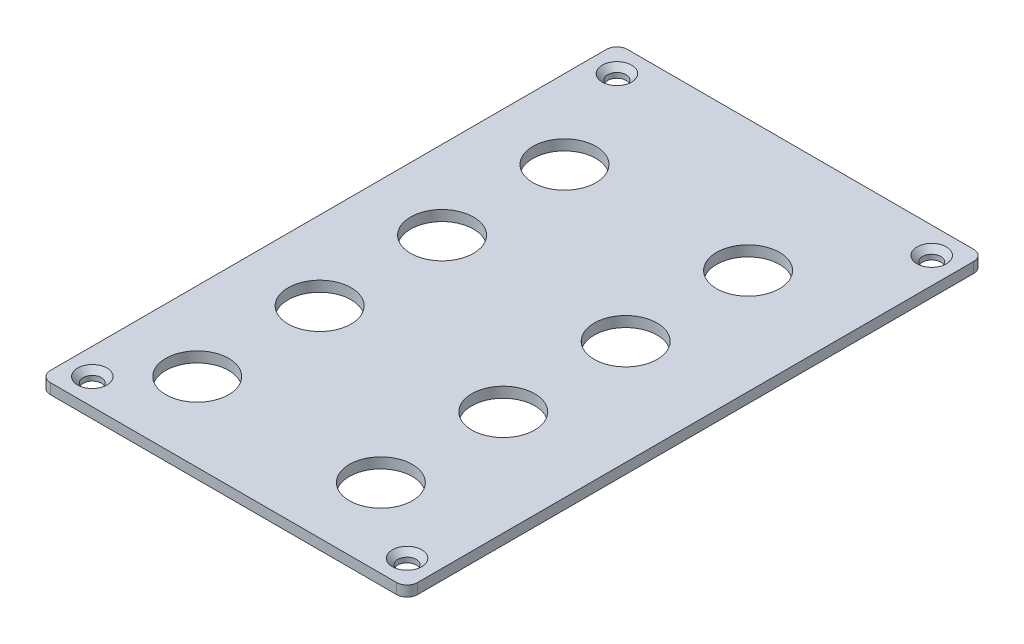
ISO-10303-21;
HEADER;
FILE_DESCRIPTION(('STEP AP214'),'2;1');
FILE_NAME('part.step','',(''),(''),'','','');
FILE_SCHEMA(('AUTOMOTIVE_DESIGN { 1 0 10303 214 1 1 1 1 }'));
ENDSEC;
DATA;
#1=APPLICATION_CONTEXT('core data for automotive mechanical design processes');
#2=APPLICATION_PROTOCOL_DEFINITION('international standard','automotive_design',2000,#1);
#3=PRODUCT_CONTEXT('',#1,'mechanical');
#4=PRODUCT('Part','Part','',(#3));
#5=PRODUCT_RELATED_PRODUCT_CATEGORY('part','',(#4));
#6=PRODUCT_DEFINITION_FORMATION('','',#4);
#7=PRODUCT_DEFINITION_CONTEXT('part definition',#1,'design');
#8=PRODUCT_DEFINITION('design','',#6,#7);
#9=PRODUCT_DEFINITION_SHAPE('','',#8);
#10=(LENGTH_UNIT() NAMED_UNIT(*) SI_UNIT(.MILLI.,.METRE.));
#11=(NAMED_UNIT(*) PLANE_ANGLE_UNIT() SI_UNIT($,.RADIAN.));
#12=(NAMED_UNIT(*) SI_UNIT($,.STERADIAN.) SOLID_ANGLE_UNIT());
#13=UNCERTAINTY_MEASURE_WITH_UNIT(LENGTH_MEASURE(1.E-05),#10,'distance_accuracy_value','');
#14=(GEOMETRIC_REPRESENTATION_CONTEXT(3) GLOBAL_UNCERTAINTY_ASSIGNED_CONTEXT((#13)) GLOBAL_UNIT_ASSIGNED_CONTEXT((#10,
#11,#12)) REPRESENTATION_CONTEXT('',''));
#15=CARTESIAN_POINT('',(0.,0.,0.));
#16=DIRECTION('',(0.,0.,1.));
#17=DIRECTION('',(1.,0.,0.));
#18=AXIS2_PLACEMENT_3D('',#15,#16,#17);
#19=CARTESIAN_POINT('',(-33.,2.,53.));
#20=DIRECTION('',(0.,-1.,0.));
#21=DIRECTION('',(0.,0.,-1.));
#22=AXIS2_PLACEMENT_3D('',#19,#20,#21);
#23=CYLINDRICAL_SURFACE('',#22,2.);
#24=DIRECTION('',(0.,-1.,0.));
#25=VECTOR('',#24,1.);
#26=CARTESIAN_POINT('',(-33.,2.,55.));
#27=LINE('',#26,#25);
#28=CARTESIAN_POINT('',(-33.,2.,55.));
#29=VERTEX_POINT('',#28);
#30=CARTESIAN_POINT('',(-33.,0.,55.));
#31=VERTEX_POINT('',#30);
#32=EDGE_CURVE('E210',#29,#31,#27,.T.);
#33=ORIENTED_EDGE('',*,*,#32,.F.);
#34=CARTESIAN_POINT('',(-33.,2.,53.));
#35=DIRECTION('',(0.,1.,0.));
#36=DIRECTION('',(0.,0.,1.));
#37=AXIS2_PLACEMENT_3D('',#34,#35,#36);
#38=CIRCLE('',#37,2.);
#39=CARTESIAN_POINT('',(-35.,2.,53.));
#40=VERTEX_POINT('',#39);
#41=EDGE_CURVE('E40',#40,#29,#38,.T.);
#42=ORIENTED_EDGE('',*,*,#41,.F.);
#43=DIRECTION('',(0.,-1.,0.));
#44=VECTOR('',#43,1.);
#45=CARTESIAN_POINT('',(-35.,2.,53.));
#46=LINE('',#45,#44);
#47=CARTESIAN_POINT('',(-35.,0.,53.));
#48=VERTEX_POINT('',#47);
#49=EDGE_CURVE('E213',#48,#40,#46,.F.);
#50=ORIENTED_EDGE('',*,*,#49,.F.);
#51=CARTESIAN_POINT('',(-33.,0.,53.));
#52=DIRECTION('',(0.,1.,0.));
#53=DIRECTION('',(0.,0.,1.));
#54=AXIS2_PLACEMENT_3D('',#51,#52,#53);
#55=CIRCLE('',#54,2.);
#56=EDGE_CURVE('E11',#31,#48,#55,.F.);
#57=ORIENTED_EDGE('',*,*,#56,.F.);
#58=EDGE_LOOP('',(#33,#42,#50,#57));
#59=FACE_BOUND('',#58,.T.);
#60=ADVANCED_FACE('F33',(#59),#23,.T.);
#61=CARTESIAN_POINT('',(33.,2.,53.));
#62=DIRECTION('',(0.,-1.,0.));
#63=DIRECTION('',(0.,0.,-1.));
#64=AXIS2_PLACEMENT_3D('',#61,#62,#63);
#65=CYLINDRICAL_SURFACE('',#64,2.);
#66=DIRECTION('',(0.,-1.,0.));
#67=VECTOR('',#66,1.);
#68=CARTESIAN_POINT('',(35.,2.,53.));
#69=LINE('',#68,#67);
#70=CARTESIAN_POINT('',(35.,2.,53.));
#71=VERTEX_POINT('',#70);
#72=CARTESIAN_POINT('',(35.,0.,53.));
#73=VERTEX_POINT('',#72);
#74=EDGE_CURVE('E199',#71,#73,#69,.T.);
#75=ORIENTED_EDGE('',*,*,#74,.F.);
#76=CARTESIAN_POINT('',(33.,2.,53.));
#77=DIRECTION('',(0.,1.,0.));
#78=DIRECTION('',(0.,0.,1.));
#79=AXIS2_PLACEMENT_3D('',#76,#77,#78);
#80=CIRCLE('',#79,2.);
#81=CARTESIAN_POINT('',(33.,2.,55.));
#82=VERTEX_POINT('',#81);
#83=EDGE_CURVE('E205',#82,#71,#80,.T.);
#84=ORIENTED_EDGE('',*,*,#83,.F.);
#85=DIRECTION('',(0.,-1.,0.));
#86=VECTOR('',#85,1.);
#87=CARTESIAN_POINT('',(33.,2.,55.));
#88=LINE('',#87,#86);
#89=CARTESIAN_POINT('',(33.,0.,55.));
#90=VERTEX_POINT('',#89);
#91=EDGE_CURVE('E202',#90,#82,#88,.F.);
#92=ORIENTED_EDGE('',*,*,#91,.F.);
#93=CARTESIAN_POINT('',(33.,0.,53.));
#94=DIRECTION('',(0.,1.,0.));
#95=DIRECTION('',(0.,0.,1.));
#96=AXIS2_PLACEMENT_3D('',#93,#94,#95);
#97=CIRCLE('',#96,2.);
#98=EDGE_CURVE('E207',#73,#90,#97,.F.);
#99=ORIENTED_EDGE('',*,*,#98,.F.);
#100=EDGE_LOOP('',(#75,#84,#92,#99));
#101=FACE_BOUND('',#100,.T.);
#102=ADVANCED_FACE('F295',(#101),#65,.T.);
#103=CARTESIAN_POINT('',(33.,2.,-53.));
#104=DIRECTION('',(0.,-1.,0.));
#105=DIRECTION('',(0.,0.,-1.));
#106=AXIS2_PLACEMENT_3D('',#103,#104,#105);
#107=CYLINDRICAL_SURFACE('',#106,2.);
#108=DIRECTION('',(0.,-1.,0.));
#109=VECTOR('',#108,1.);
#110=CARTESIAN_POINT('',(33.,2.,-55.));
#111=LINE('',#110,#109);
#112=CARTESIAN_POINT('',(33.,2.,-55.));
#113=VERTEX_POINT('',#112);
#114=CARTESIAN_POINT('',(33.,0.,-55.));
#115=VERTEX_POINT('',#114);
#116=EDGE_CURVE('E105',#113,#115,#111,.T.);
#117=ORIENTED_EDGE('',*,*,#116,.F.);
#118=CARTESIAN_POINT('',(33.,2.,-53.));
#119=DIRECTION('',(0.,1.,0.));
#120=DIRECTION('',(0.,0.,1.));
#121=AXIS2_PLACEMENT_3D('',#118,#119,#120);
#122=CIRCLE('',#121,2.);
#123=CARTESIAN_POINT('',(35.,2.,-53.));
#124=VERTEX_POINT('',#123);
#125=EDGE_CURVE('E194',#124,#113,#122,.T.);
#126=ORIENTED_EDGE('',*,*,#125,.F.);
#127=DIRECTION('',(0.,-1.,0.));
#128=VECTOR('',#127,1.);
#129=CARTESIAN_POINT('',(35.,2.,-53.));
#130=LINE('',#129,#128);
#131=CARTESIAN_POINT('',(35.,0.,-53.));
#132=VERTEX_POINT('',#131);
#133=EDGE_CURVE('E191',#132,#124,#130,.F.);
#134=ORIENTED_EDGE('',*,*,#133,.F.);
#135=CARTESIAN_POINT('',(33.,0.,-53.));
#136=DIRECTION('',(0.,1.,0.));
#137=DIRECTION('',(0.,0.,1.));
#138=AXIS2_PLACEMENT_3D('',#135,#136,#137);
#139=CIRCLE('',#138,2.);
#140=EDGE_CURVE('E196',#115,#132,#139,.F.);
#141=ORIENTED_EDGE('',*,*,#140,.F.);
#142=EDGE_LOOP('',(#117,#126,#134,#141));
#143=FACE_BOUND('',#142,.T.);
#144=ADVANCED_FACE('F299',(#143),#107,.T.);
#145=CARTESIAN_POINT('',(-33.,2.,-53.));
#146=DIRECTION('',(0.,-1.,0.));
#147=DIRECTION('',(0.,0.,-1.));
#148=AXIS2_PLACEMENT_3D('',#145,#146,#147);
#149=CYLINDRICAL_SURFACE('',#148,2.);
#150=DIRECTION('',(0.,-1.,0.));
#151=VECTOR('',#150,1.);
#152=CARTESIAN_POINT('',(-35.,2.,-53.));
#153=LINE('',#152,#151);
#154=CARTESIAN_POINT('',(-35.,2.,-53.));
#155=VERTEX_POINT('',#154);
#156=CARTESIAN_POINT('',(-35.,0.,-53.));
#157=VERTEX_POINT('',#156);
#158=EDGE_CURVE('E100',#155,#157,#153,.T.);
#159=ORIENTED_EDGE('',*,*,#158,.F.);
#160=CARTESIAN_POINT('',(-33.,2.,-53.));
#161=DIRECTION('',(0.,1.,0.));
#162=DIRECTION('',(0.,0.,1.));
#163=AXIS2_PLACEMENT_3D('',#160,#161,#162);
#164=CIRCLE('',#163,2.);
#165=CARTESIAN_POINT('',(-33.,2.,-55.));
#166=VERTEX_POINT('',#165);
#167=EDGE_CURVE('E106',#166,#155,#164,.T.);
#168=ORIENTED_EDGE('',*,*,#167,.F.);
#169=DIRECTION('',(0.,-1.,0.));
#170=VECTOR('',#169,1.);
#171=CARTESIAN_POINT('',(-33.,2.,-55.));
#172=LINE('',#171,#170);
#173=CARTESIAN_POINT('',(-33.,0.,-55.));
#174=VERTEX_POINT('',#173);
#175=EDGE_CURVE('E103',#174,#166,#172,.F.);
#176=ORIENTED_EDGE('',*,*,#175,.F.);
#177=CARTESIAN_POINT('',(-33.,0.,-53.));
#178=DIRECTION('',(0.,1.,0.));
#179=DIRECTION('',(0.,0.,1.));
#180=AXIS2_PLACEMENT_3D('',#177,#178,#179);
#181=CIRCLE('',#180,2.);
#182=EDGE_CURVE('E96',#157,#174,#181,.F.);
#183=ORIENTED_EDGE('',*,*,#182,.F.);
#184=EDGE_LOOP('',(#159,#168,#176,#183));
#185=FACE_BOUND('',#184,.T.);
#186=ADVANCED_FACE('F98',(#185),#149,.T.);
#187=CARTESIAN_POINT('',(-35.,2.,55.));
#188=DIRECTION('',(1.,0.,0.));
#189=DIRECTION('',(0.,0.,-1.));
#190=AXIS2_PLACEMENT_3D('',#187,#188,#189);
#191=PLANE('',#190);
#192=DIRECTION('',(0.,0.,1.));
#193=VECTOR('',#192,1.);
#194=CARTESIAN_POINT('',(-35.,0.,55.));
#195=LINE('',#194,#193);
#196=EDGE_CURVE('E111',#157,#48,#195,.T.);
#197=ORIENTED_EDGE('',*,*,#196,.T.);
#198=ORIENTED_EDGE('',*,*,#49,.T.);
#199=DIRECTION('',(0.,0.,1.));
#200=VECTOR('',#199,1.);
#201=CARTESIAN_POINT('',(-35.,2.,55.));
#202=LINE('',#201,#200);
#203=EDGE_CURVE('E113',#155,#40,#202,.T.);
#204=ORIENTED_EDGE('',*,*,#203,.F.);
#205=ORIENTED_EDGE('',*,*,#158,.T.);
#206=EDGE_LOOP('',(#197,#198,#204,#205));
#207=FACE_BOUND('',#206,.T.);
#208=ADVANCED_FACE('F110',(#207),#191,.F.);
#209=CARTESIAN_POINT('',(35.,2.,55.));
#210=DIRECTION('',(0.,0.,-1.));
#211=DIRECTION('',(-1.,0.,0.));
#212=AXIS2_PLACEMENT_3D('',#209,#210,#211);
#213=PLANE('',#212);
#214=DIRECTION('',(1.,0.,0.));
#215=VECTOR('',#214,1.);
#216=CARTESIAN_POINT('',(35.,2.,55.));
#217=LINE('',#216,#215);
#218=EDGE_CURVE('E217',#29,#82,#217,.T.);
#219=ORIENTED_EDGE('',*,*,#218,.F.);
#220=ORIENTED_EDGE('',*,*,#32,.T.);
#221=DIRECTION('',(1.,0.,0.));
#222=VECTOR('',#221,1.);
#223=CARTESIAN_POINT('',(35.,0.,55.));
#224=LINE('',#223,#222);
#225=EDGE_CURVE('E117',#31,#90,#224,.T.);
#226=ORIENTED_EDGE('',*,*,#225,.T.);
#227=ORIENTED_EDGE('',*,*,#91,.T.);
#228=EDGE_LOOP('',(#219,#220,#226,#227));
#229=FACE_BOUND('',#228,.T.);
#230=ADVANCED_FACE('F220',(#229),#213,.F.);
#231=CARTESIAN_POINT('',(35.,2.,55.));
#232=DIRECTION('',(-1.,0.,0.));
#233=DIRECTION('',(0.,0.,1.));
#234=AXIS2_PLACEMENT_3D('',#231,#232,#233);
#235=PLANE('',#234);
#236=DIRECTION('',(0.,0.,-1.));
#237=VECTOR('',#236,1.);
#238=CARTESIAN_POINT('',(35.,2.,55.));
#239=LINE('',#238,#237);
#240=EDGE_CURVE('E222',#71,#124,#239,.T.);
#241=ORIENTED_EDGE('',*,*,#240,.F.);
#242=ORIENTED_EDGE('',*,*,#74,.T.);
#243=DIRECTION('',(0.,0.,-1.));
#244=VECTOR('',#243,1.);
#245=CARTESIAN_POINT('',(35.,0.,55.));
#246=LINE('',#245,#244);
#247=EDGE_CURVE('E120',#73,#132,#246,.T.);
#248=ORIENTED_EDGE('',*,*,#247,.T.);
#249=ORIENTED_EDGE('',*,*,#133,.T.);
#250=EDGE_LOOP('',(#241,#242,#248,#249));
#251=FACE_BOUND('',#250,.T.);
#252=ADVANCED_FACE('F314',(#251),#235,.F.);
#253=CARTESIAN_POINT('',(35.,2.,-55.));
#254=DIRECTION('',(0.,0.,1.));
#255=DIRECTION('',(1.,0.,0.));
#256=AXIS2_PLACEMENT_3D('',#253,#254,#255);
#257=PLANE('',#256);
#258=DIRECTION('',(-1.,0.,0.));
#259=VECTOR('',#258,1.);
#260=CARTESIAN_POINT('',(35.,2.,-55.));
#261=LINE('',#260,#259);
#262=EDGE_CURVE('E114',#113,#166,#261,.T.);
#263=ORIENTED_EDGE('',*,*,#262,.F.);
#264=ORIENTED_EDGE('',*,*,#116,.T.);
#265=DIRECTION('',(-1.,0.,0.));
#266=VECTOR('',#265,1.);
#267=CARTESIAN_POINT('',(35.,0.,-55.));
#268=LINE('',#267,#266);
#269=EDGE_CURVE('E129',#115,#174,#268,.T.);
#270=ORIENTED_EDGE('',*,*,#269,.T.);
#271=ORIENTED_EDGE('',*,*,#175,.T.);
#272=EDGE_LOOP('',(#263,#264,#270,#271));
#273=FACE_BOUND('',#272,.T.);
#274=ADVANCED_FACE('F256',(#273),#257,.F.);
#275=CARTESIAN_POINT('',(0.,2.,0.));
#276=DIRECTION('',(0.,1.,0.));
#277=DIRECTION('',(0.,0.,1.));
#278=AXIS2_PLACEMENT_3D('',#275,#276,#277);
#279=PLANE('',#278);
#280=CARTESIAN_POINT('',(-30.,2.,50.));
#281=DIRECTION('',(0.,1.,0.));
#282=DIRECTION('',(0.,0.,1.));
#283=AXIS2_PLACEMENT_3D('',#280,#281,#282);
#284=CIRCLE('',#283,2.8);
#285=CARTESIAN_POINT('',(-30.,2.,52.8));
#286=VERTEX_POINT('',#285);
#287=EDGE_CURVE('E185',#286,#286,#284,.T.);
#288=ORIENTED_EDGE('',*,*,#287,.F.);
#289=EDGE_LOOP('',(#288));
#290=FACE_BOUND('',#289,.T.);
#291=CARTESIAN_POINT('',(30.,2.,50.));
#292=DIRECTION('',(0.,1.,0.));
#293=DIRECTION('',(0.,0.,1.));
#294=AXIS2_PLACEMENT_3D('',#291,#292,#293);
#295=CIRCLE('',#294,2.8);
#296=CARTESIAN_POINT('',(30.,2.,52.8));
#297=VERTEX_POINT('',#296);
#298=EDGE_CURVE('E182',#297,#297,#295,.T.);
#299=ORIENTED_EDGE('',*,*,#298,.F.);
#300=EDGE_LOOP('',(#299));
#301=FACE_BOUND('',#300,.T.);
#302=CARTESIAN_POINT('',(30.,2.,-50.));
#303=DIRECTION('',(0.,1.,0.));
#304=DIRECTION('',(0.,0.,1.));
#305=AXIS2_PLACEMENT_3D('',#302,#303,#304);
#306=CIRCLE('',#305,2.8);
#307=CARTESIAN_POINT('',(30.,2.,-47.2));
#308=VERTEX_POINT('',#307);
#309=EDGE_CURVE('E178',#308,#308,#306,.T.);
#310=ORIENTED_EDGE('',*,*,#309,.F.);
#311=EDGE_LOOP('',(#310));
#312=FACE_BOUND('',#311,.T.);
#313=CARTESIAN_POINT('',(-30.,2.,-50.));
#314=DIRECTION('',(0.,1.,0.));
#315=DIRECTION('',(0.,0.,1.));
#316=AXIS2_PLACEMENT_3D('',#313,#314,#315);
#317=CIRCLE('',#316,2.8);
#318=CARTESIAN_POINT('',(-30.,2.,-47.2));
#319=VERTEX_POINT('',#318);
#320=EDGE_CURVE('E174',#319,#319,#317,.T.);
#321=ORIENTED_EDGE('',*,*,#320,.F.);
#322=EDGE_LOOP('',(#321));
#323=FACE_BOUND('',#322,.T.);
#324=CARTESIAN_POINT('',(15.,2.,40.));
#325=DIRECTION('',(0.,1.,0.));
#326=DIRECTION('',(0.,0.,1.));
#327=AXIS2_PLACEMENT_3D('',#324,#325,#326);
#328=CIRCLE('',#327,6.);
#329=CARTESIAN_POINT('',(15.,2.,46.));
#330=VERTEX_POINT('',#329);
#331=EDGE_CURVE('E158',#330,#330,#328,.T.);
#332=ORIENTED_EDGE('',*,*,#331,.F.);
#333=EDGE_LOOP('',(#332));
#334=FACE_BOUND('',#333,.T.);
#335=CARTESIAN_POINT('',(15.,2.,16.6666666666667));
#336=DIRECTION('',(0.,1.,0.));
#337=DIRECTION('',(0.,0.,1.));
#338=AXIS2_PLACEMENT_3D('',#335,#336,#337);
#339=CIRCLE('',#338,6.);
#340=CARTESIAN_POINT('',(15.,2.,22.6666666666667));
#341=VERTEX_POINT('',#340);
#342=EDGE_CURVE('E154',#341,#341,#339,.T.);
#343=ORIENTED_EDGE('',*,*,#342,.F.);
#344=EDGE_LOOP('',(#343));
#345=FACE_BOUND('',#344,.T.);
#346=CARTESIAN_POINT('',(-20.,2.,40.));
#347=DIRECTION('',(0.,1.,0.));
#348=DIRECTION('',(0.,0.,1.));
#349=AXIS2_PLACEMENT_3D('',#346,#347,#348);
#350=CIRCLE('',#349,6.);
#351=CARTESIAN_POINT('',(-20.,2.,46.));
#352=VERTEX_POINT('',#351);
#353=EDGE_CURVE('E150',#352,#352,#350,.T.);
#354=ORIENTED_EDGE('',*,*,#353,.F.);
#355=EDGE_LOOP('',(#354));
#356=FACE_BOUND('',#355,.T.);
#357=CARTESIAN_POINT('',(-20.,2.,16.6666666666667));
#358=DIRECTION('',(0.,1.,0.));
#359=DIRECTION('',(0.,0.,1.));
#360=AXIS2_PLACEMENT_3D('',#357,#358,#359);
#361=CIRCLE('',#360,6.);
#362=CARTESIAN_POINT('',(-20.,2.,22.6666666666667));
#363=VERTEX_POINT('',#362);
#364=EDGE_CURVE('E146',#363,#363,#361,.T.);
#365=ORIENTED_EDGE('',*,*,#364,.F.);
#366=EDGE_LOOP('',(#365));
#367=FACE_BOUND('',#366,.T.);
#368=CARTESIAN_POINT('',(15.,2.,-6.66666666666667));
#369=DIRECTION('',(0.,1.,0.));
#370=DIRECTION('',(0.,0.,1.));
#371=AXIS2_PLACEMENT_3D('',#368,#369,#370);
#372=CIRCLE('',#371,6.);
#373=CARTESIAN_POINT('',(15.,2.,-0.666666666666677));
#374=VERTEX_POINT('',#373);
#375=EDGE_CURVE('E142',#374,#374,#372,.T.);
#376=ORIENTED_EDGE('',*,*,#375,.F.);
#377=EDGE_LOOP('',(#376));
#378=FACE_BOUND('',#377,.T.);
#379=CARTESIAN_POINT('',(-20.,2.,-6.66666666666667));
#380=DIRECTION('',(0.,1.,0.));
#381=DIRECTION('',(0.,0.,1.));
#382=AXIS2_PLACEMENT_3D('',#379,#380,#381);
#383=CIRCLE('',#382,6.);
#384=CARTESIAN_POINT('',(-20.,2.,-0.666666666666677));
#385=VERTEX_POINT('',#384);
#386=EDGE_CURVE('E138',#385,#385,#383,.T.);
#387=ORIENTED_EDGE('',*,*,#386,.F.);
#388=EDGE_LOOP('',(#387));
#389=FACE_BOUND('',#388,.T.);
#390=CARTESIAN_POINT('',(15.,2.,-30.));
#391=DIRECTION('',(0.,1.,0.));
#392=DIRECTION('',(0.,0.,1.));
#393=AXIS2_PLACEMENT_3D('',#390,#391,#392);
#394=CIRCLE('',#393,6.);
#395=CARTESIAN_POINT('',(15.,2.,-24.));
#396=VERTEX_POINT('',#395);
#397=EDGE_CURVE('E134',#396,#396,#394,.T.);
#398=ORIENTED_EDGE('',*,*,#397,.F.);
#399=EDGE_LOOP('',(#398));
#400=FACE_BOUND('',#399,.T.);
#401=CARTESIAN_POINT('',(-20.,2.,-30.));
#402=DIRECTION('',(0.,1.,0.));
#403=DIRECTION('',(0.,0.,1.));
#404=AXIS2_PLACEMENT_3D('',#401,#402,#403);
#405=CIRCLE('',#404,6.);
#406=CARTESIAN_POINT('',(-20.,2.,-24.));
#407=VERTEX_POINT('',#406);
#408=EDGE_CURVE('E123',#407,#407,#405,.T.);
#409=ORIENTED_EDGE('',*,*,#408,.F.);
#410=EDGE_LOOP('',(#409));
#411=FACE_BOUND('',#410,.T.);
#412=ORIENTED_EDGE('',*,*,#203,.T.);
#413=ORIENTED_EDGE('',*,*,#41,.T.);
#414=ORIENTED_EDGE('',*,*,#218,.T.);
#415=ORIENTED_EDGE('',*,*,#83,.T.);
#416=ORIENTED_EDGE('',*,*,#240,.T.);
#417=ORIENTED_EDGE('',*,*,#125,.T.);
#418=ORIENTED_EDGE('',*,*,#262,.T.);
#419=ORIENTED_EDGE('',*,*,#167,.T.);
#420=EDGE_LOOP('',(#412,#413,#414,#415,#416,#417,#418,#419));
#421=FACE_BOUND('',#420,.T.);
#422=ADVANCED_FACE('F215',(#290,#301,#312,#323,#334,#345,#356,#367,#378,#389,#400,#411,#421),
#279,.T.);
#423=CARTESIAN_POINT('',(0.,0.,0.));
#424=DIRECTION('',(0.,1.,0.));
#425=DIRECTION('',(0.,0.,1.));
#426=AXIS2_PLACEMENT_3D('',#423,#424,#425);
#427=PLANE('',#426);
#428=CARTESIAN_POINT('',(30.,0.,50.));
#429=DIRECTION('',(0.,1.,0.));
#430=DIRECTION('',(0.,0.,1.));
#431=AXIS2_PLACEMENT_3D('',#428,#429,#430);
#432=CIRCLE('',#431,1.75);
#433=CARTESIAN_POINT('',(30.,0.,51.75));
#434=VERTEX_POINT('',#433);
#435=EDGE_CURVE('E168',#434,#434,#432,.T.);
#436=ORIENTED_EDGE('',*,*,#435,.T.);
#437=EDGE_LOOP('',(#436));
#438=FACE_BOUND('',#437,.T.);
#439=CARTESIAN_POINT('',(-30.,0.,50.));
#440=DIRECTION('',(0.,1.,0.));
#441=DIRECTION('',(0.,0.,1.));
#442=AXIS2_PLACEMENT_3D('',#439,#440,#441);
#443=CIRCLE('',#442,1.75);
#444=CARTESIAN_POINT('',(-30.,0.,51.75));
#445=VERTEX_POINT('',#444);
#446=EDGE_CURVE('E165',#445,#445,#443,.T.);
#447=ORIENTED_EDGE('',*,*,#446,.T.);
#448=EDGE_LOOP('',(#447));
#449=FACE_BOUND('',#448,.T.);
#450=CARTESIAN_POINT('',(30.,0.,-50.));
#451=DIRECTION('',(0.,1.,0.));
#452=DIRECTION('',(0.,0.,1.));
#453=AXIS2_PLACEMENT_3D('',#450,#451,#452);
#454=CIRCLE('',#453,1.75);
#455=CARTESIAN_POINT('',(30.,0.,-48.25));
#456=VERTEX_POINT('',#455);
#457=EDGE_CURVE('E162',#456,#456,#454,.T.);
#458=ORIENTED_EDGE('',*,*,#457,.T.);
#459=EDGE_LOOP('',(#458));
#460=FACE_BOUND('',#459,.T.);
#461=CARTESIAN_POINT('',(-30.,0.,-50.));
#462=DIRECTION('',(0.,1.,0.));
#463=DIRECTION('',(0.,0.,1.));
#464=AXIS2_PLACEMENT_3D('',#461,#462,#463);
#465=CIRCLE('',#464,1.75);
#466=CARTESIAN_POINT('',(-30.,0.,-48.25));
#467=VERTEX_POINT('',#466);
#468=EDGE_CURVE('E159',#467,#467,#465,.T.);
#469=ORIENTED_EDGE('',*,*,#468,.T.);
#470=EDGE_LOOP('',(#469));
#471=FACE_BOUND('',#470,.T.);
#472=CARTESIAN_POINT('',(15.,0.,40.));
#473=DIRECTION('',(0.,1.,0.));
#474=DIRECTION('',(0.,0.,1.));
#475=AXIS2_PLACEMENT_3D('',#472,#473,#474);
#476=CIRCLE('',#475,6.);
#477=CARTESIAN_POINT('',(15.,0.,46.));
#478=VERTEX_POINT('',#477);
#479=EDGE_CURVE('E155',#478,#478,#476,.T.);
#480=ORIENTED_EDGE('',*,*,#479,.T.);
#481=EDGE_LOOP('',(#480));
#482=FACE_BOUND('',#481,.T.);
#483=CARTESIAN_POINT('',(15.,0.,16.6666666666667));
#484=DIRECTION('',(0.,1.,0.));
#485=DIRECTION('',(0.,0.,1.));
#486=AXIS2_PLACEMENT_3D('',#483,#484,#485);
#487=CIRCLE('',#486,6.);
#488=CARTESIAN_POINT('',(15.,0.,22.6666666666667));
#489=VERTEX_POINT('',#488);
#490=EDGE_CURVE('E151',#489,#489,#487,.T.);
#491=ORIENTED_EDGE('',*,*,#490,.T.);
#492=EDGE_LOOP('',(#491));
#493=FACE_BOUND('',#492,.T.);
#494=CARTESIAN_POINT('',(-20.,0.,40.));
#495=DIRECTION('',(0.,1.,0.));
#496=DIRECTION('',(0.,0.,1.));
#497=AXIS2_PLACEMENT_3D('',#494,#495,#496);
#498=CIRCLE('',#497,6.);
#499=CARTESIAN_POINT('',(-20.,0.,46.));
#500=VERTEX_POINT('',#499);
#501=EDGE_CURVE('E147',#500,#500,#498,.T.);
#502=ORIENTED_EDGE('',*,*,#501,.T.);
#503=EDGE_LOOP('',(#502));
#504=FACE_BOUND('',#503,.T.);
#505=CARTESIAN_POINT('',(-20.,0.,16.6666666666667));
#506=DIRECTION('',(0.,1.,0.));
#507=DIRECTION('',(0.,0.,1.));
#508=AXIS2_PLACEMENT_3D('',#505,#506,#507);
#509=CIRCLE('',#508,6.);
#510=CARTESIAN_POINT('',(-20.,0.,22.6666666666667));
#511=VERTEX_POINT('',#510);
#512=EDGE_CURVE('E143',#511,#511,#509,.T.);
#513=ORIENTED_EDGE('',*,*,#512,.T.);
#514=EDGE_LOOP('',(#513));
#515=FACE_BOUND('',#514,.T.);
#516=CARTESIAN_POINT('',(15.,0.,-6.66666666666667));
#517=DIRECTION('',(0.,1.,0.));
#518=DIRECTION('',(0.,0.,1.));
#519=AXIS2_PLACEMENT_3D('',#516,#517,#518);
#520=CIRCLE('',#519,6.);
#521=CARTESIAN_POINT('',(15.,0.,-0.666666666666677));
#522=VERTEX_POINT('',#521);
#523=EDGE_CURVE('E139',#522,#522,#520,.T.);
#524=ORIENTED_EDGE('',*,*,#523,.T.);
#525=EDGE_LOOP('',(#524));
#526=FACE_BOUND('',#525,.T.);
#527=CARTESIAN_POINT('',(-20.,0.,-6.66666666666667));
#528=DIRECTION('',(0.,1.,0.));
#529=DIRECTION('',(0.,0.,1.));
#530=AXIS2_PLACEMENT_3D('',#527,#528,#529);
#531=CIRCLE('',#530,6.);
#532=CARTESIAN_POINT('',(-20.,0.,-0.666666666666677));
#533=VERTEX_POINT('',#532);
#534=EDGE_CURVE('E135',#533,#533,#531,.T.);
#535=ORIENTED_EDGE('',*,*,#534,.T.);
#536=EDGE_LOOP('',(#535));
#537=FACE_BOUND('',#536,.T.);
#538=CARTESIAN_POINT('',(15.,0.,-30.));
#539=DIRECTION('',(0.,1.,0.));
#540=DIRECTION('',(0.,0.,1.));
#541=AXIS2_PLACEMENT_3D('',#538,#539,#540);
#542=CIRCLE('',#541,6.);
#543=CARTESIAN_POINT('',(15.,0.,-24.));
#544=VERTEX_POINT('',#543);
#545=EDGE_CURVE('E131',#544,#544,#542,.T.);
#546=ORIENTED_EDGE('',*,*,#545,.T.);
#547=EDGE_LOOP('',(#546));
#548=FACE_BOUND('',#547,.T.);
#549=CARTESIAN_POINT('',(-20.,0.,-30.));
#550=DIRECTION('',(0.,1.,0.));
#551=DIRECTION('',(0.,0.,1.));
#552=AXIS2_PLACEMENT_3D('',#549,#550,#551);
#553=CIRCLE('',#552,6.);
#554=CARTESIAN_POINT('',(-20.,0.,-24.));
#555=VERTEX_POINT('',#554);
#556=EDGE_CURVE('E118',#555,#555,#553,.T.);
#557=ORIENTED_EDGE('',*,*,#556,.T.);
#558=EDGE_LOOP('',(#557));
#559=FACE_BOUND('',#558,.T.);
#560=ORIENTED_EDGE('',*,*,#225,.F.);
#561=ORIENTED_EDGE('',*,*,#56,.T.);
#562=ORIENTED_EDGE('',*,*,#196,.F.);
#563=ORIENTED_EDGE('',*,*,#182,.T.);
#564=ORIENTED_EDGE('',*,*,#269,.F.);
#565=ORIENTED_EDGE('',*,*,#140,.T.);
#566=ORIENTED_EDGE('',*,*,#247,.F.);
#567=ORIENTED_EDGE('',*,*,#98,.T.);
#568=EDGE_LOOP('',(#560,#561,#562,#563,#564,#565,#566,#567));
#569=FACE_BOUND('',#568,.T.);
#570=ADVANCED_FACE('F116',(#438,#449,#460,#471,#482,#493,#504,#515,#526,#537,#548,#559,#569),
#427,.F.);
#571=CARTESIAN_POINT('',(-20.,-8.,-30.));
#572=DIRECTION('',(0.,1.,0.));
#573=DIRECTION('',(0.,0.,1.));
#574=AXIS2_PLACEMENT_3D('',#571,#572,#573);
#575=CYLINDRICAL_SURFACE('',#574,6.);
#576=ORIENTED_EDGE('',*,*,#408,.T.);
#577=EDGE_LOOP('',(#576));
#578=FACE_BOUND('',#577,.T.);
#579=ORIENTED_EDGE('',*,*,#556,.F.);
#580=EDGE_LOOP('',(#579));
#581=FACE_BOUND('',#580,.T.);
#582=ADVANCED_FACE('F280',(#578,#581),#575,.F.);
#583=CARTESIAN_POINT('',(15.,-8.,-30.));
#584=DIRECTION('',(0.,1.,0.));
#585=DIRECTION('',(0.,0.,1.));
#586=AXIS2_PLACEMENT_3D('',#583,#584,#585);
#587=CYLINDRICAL_SURFACE('',#586,6.);
#588=ORIENTED_EDGE('',*,*,#397,.T.);
#589=EDGE_LOOP('',(#588));
#590=FACE_BOUND('',#589,.T.);
#591=ORIENTED_EDGE('',*,*,#545,.F.);
#592=EDGE_LOOP('',(#591));
#593=FACE_BOUND('',#592,.T.);
#594=ADVANCED_FACE('F283',(#590,#593),#587,.F.);
#595=CARTESIAN_POINT('',(-20.,-8.,-6.66666666666667));
#596=DIRECTION('',(0.,1.,0.));
#597=DIRECTION('',(0.,0.,1.));
#598=AXIS2_PLACEMENT_3D('',#595,#596,#597);
#599=CYLINDRICAL_SURFACE('',#598,6.);
#600=ORIENTED_EDGE('',*,*,#386,.T.);
#601=EDGE_LOOP('',(#600));
#602=FACE_BOUND('',#601,.T.);
#603=ORIENTED_EDGE('',*,*,#534,.F.);
#604=EDGE_LOOP('',(#603));
#605=FACE_BOUND('',#604,.T.);
#606=ADVANCED_FACE('F357',(#602,#605),#599,.F.);
#607=CARTESIAN_POINT('',(15.,-8.,-6.66666666666667));
#608=DIRECTION('',(0.,1.,0.));
#609=DIRECTION('',(0.,0.,1.));
#610=AXIS2_PLACEMENT_3D('',#607,#608,#609);
#611=CYLINDRICAL_SURFACE('',#610,6.);
#612=ORIENTED_EDGE('',*,*,#375,.T.);
#613=EDGE_LOOP('',(#612));
#614=FACE_BOUND('',#613,.T.);
#615=ORIENTED_EDGE('',*,*,#523,.F.);
#616=EDGE_LOOP('',(#615));
#617=FACE_BOUND('',#616,.T.);
#618=ADVANCED_FACE('F366',(#614,#617),#611,.F.);
#619=CARTESIAN_POINT('',(-20.,-8.,16.6666666666667));
#620=DIRECTION('',(0.,1.,0.));
#621=DIRECTION('',(0.,0.,1.));
#622=AXIS2_PLACEMENT_3D('',#619,#620,#621);
#623=CYLINDRICAL_SURFACE('',#622,6.);
#624=ORIENTED_EDGE('',*,*,#364,.T.);
#625=EDGE_LOOP('',(#624));
#626=FACE_BOUND('',#625,.T.);
#627=ORIENTED_EDGE('',*,*,#512,.F.);
#628=EDGE_LOOP('',(#627));
#629=FACE_BOUND('',#628,.T.);
#630=ADVANCED_FACE('F375',(#626,#629),#623,.F.);
#631=CARTESIAN_POINT('',(-20.,-8.,40.));
#632=DIRECTION('',(0.,1.,0.));
#633=DIRECTION('',(0.,0.,1.));
#634=AXIS2_PLACEMENT_3D('',#631,#632,#633);
#635=CYLINDRICAL_SURFACE('',#634,6.);
#636=ORIENTED_EDGE('',*,*,#353,.T.);
#637=EDGE_LOOP('',(#636));
#638=FACE_BOUND('',#637,.T.);
#639=ORIENTED_EDGE('',*,*,#501,.F.);
#640=EDGE_LOOP('',(#639));
#641=FACE_BOUND('',#640,.T.);
#642=ADVANCED_FACE('F384',(#638,#641),#635,.F.);
#643=CARTESIAN_POINT('',(15.,-8.,16.6666666666667));
#644=DIRECTION('',(0.,1.,0.));
#645=DIRECTION('',(0.,0.,1.));
#646=AXIS2_PLACEMENT_3D('',#643,#644,#645);
#647=CYLINDRICAL_SURFACE('',#646,6.);
#648=ORIENTED_EDGE('',*,*,#342,.T.);
#649=EDGE_LOOP('',(#648));
#650=FACE_BOUND('',#649,.T.);
#651=ORIENTED_EDGE('',*,*,#490,.F.);
#652=EDGE_LOOP('',(#651));
#653=FACE_BOUND('',#652,.T.);
#654=ADVANCED_FACE('F393',(#650,#653),#647,.F.);
#655=CARTESIAN_POINT('',(15.,-8.,40.));
#656=DIRECTION('',(0.,1.,0.));
#657=DIRECTION('',(0.,0.,1.));
#658=AXIS2_PLACEMENT_3D('',#655,#656,#657);
#659=CYLINDRICAL_SURFACE('',#658,6.);
#660=ORIENTED_EDGE('',*,*,#331,.T.);
#661=EDGE_LOOP('',(#660));
#662=FACE_BOUND('',#661,.T.);
#663=ORIENTED_EDGE('',*,*,#479,.F.);
#664=EDGE_LOOP('',(#663));
#665=FACE_BOUND('',#664,.T.);
#666=ADVANCED_FACE('F402',(#662,#665),#659,.F.);
#667=CARTESIAN_POINT('',(-30.,-8.,-50.));
#668=DIRECTION('',(0.,1.,0.));
#669=DIRECTION('',(0.,0.,1.));
#670=AXIS2_PLACEMENT_3D('',#667,#668,#669);
#671=CYLINDRICAL_SURFACE('',#670,1.75);
#672=CARTESIAN_POINT('',(-30.,0.950000000000005,-50.));
#673=DIRECTION('',(0.,1.,0.));
#674=DIRECTION('',(0.,0.,1.));
#675=AXIS2_PLACEMENT_3D('',#672,#673,#674);
#676=CIRCLE('',#675,1.75);
#677=CARTESIAN_POINT('',(-30.,0.950000000000005,-48.25));
#678=VERTEX_POINT('',#677);
#679=EDGE_CURVE('E171',#678,#678,#676,.T.);
#680=ORIENTED_EDGE('',*,*,#679,.T.);
#681=EDGE_LOOP('',(#680));
#682=FACE_BOUND('',#681,.T.);
#683=ORIENTED_EDGE('',*,*,#468,.F.);
#684=EDGE_LOOP('',(#683));
#685=FACE_BOUND('',#684,.T.);
#686=ADVANCED_FACE('F411',(#682,#685),#671,.F.);
#687=CARTESIAN_POINT('',(30.,-8.,-50.));
#688=DIRECTION('',(0.,1.,0.));
#689=DIRECTION('',(0.,0.,1.));
#690=AXIS2_PLACEMENT_3D('',#687,#688,#689);
#691=CYLINDRICAL_SURFACE('',#690,1.75);
#692=CARTESIAN_POINT('',(30.,0.950000000000003,-50.));
#693=DIRECTION('',(0.,1.,0.));
#694=DIRECTION('',(0.,0.,1.));
#695=AXIS2_PLACEMENT_3D('',#692,#693,#694);
#696=CIRCLE('',#695,1.75);
#697=CARTESIAN_POINT('',(30.,0.950000000000003,-48.25));
#698=VERTEX_POINT('',#697);
#699=EDGE_CURVE('E175',#698,#698,#696,.T.);
#700=ORIENTED_EDGE('',*,*,#699,.T.);
#701=EDGE_LOOP('',(#700));
#702=FACE_BOUND('',#701,.T.);
#703=ORIENTED_EDGE('',*,*,#457,.F.);
#704=EDGE_LOOP('',(#703));
#705=FACE_BOUND('',#704,.T.);
#706=ADVANCED_FACE('F420',(#702,#705),#691,.F.);
#707=CARTESIAN_POINT('',(-30.,-8.,50.));
#708=DIRECTION('',(0.,1.,0.));
#709=DIRECTION('',(0.,0.,1.));
#710=AXIS2_PLACEMENT_3D('',#707,#708,#709);
#711=CYLINDRICAL_SURFACE('',#710,1.75);
#712=CARTESIAN_POINT('',(-30.,0.950000000000006,50.));
#713=DIRECTION('',(0.,1.,0.));
#714=DIRECTION('',(0.,0.,1.));
#715=AXIS2_PLACEMENT_3D('',#712,#713,#714);
#716=CIRCLE('',#715,1.75);
#717=CARTESIAN_POINT('',(-30.,0.950000000000006,51.75));
#718=VERTEX_POINT('',#717);
#719=EDGE_CURVE('E183',#718,#718,#716,.T.);
#720=ORIENTED_EDGE('',*,*,#719,.T.);
#721=EDGE_LOOP('',(#720));
#722=FACE_BOUND('',#721,.T.);
#723=ORIENTED_EDGE('',*,*,#446,.F.);
#724=EDGE_LOOP('',(#723));
#725=FACE_BOUND('',#724,.T.);
#726=ADVANCED_FACE('F429',(#722,#725),#711,.F.);
#727=CARTESIAN_POINT('',(30.,-8.,50.));
#728=DIRECTION('',(0.,1.,0.));
#729=DIRECTION('',(0.,0.,1.));
#730=AXIS2_PLACEMENT_3D('',#727,#728,#729);
#731=CYLINDRICAL_SURFACE('',#730,1.75);
#732=CARTESIAN_POINT('',(30.,0.95000000000001,50.));
#733=DIRECTION('',(0.,1.,0.));
#734=DIRECTION('',(0.,0.,1.));
#735=AXIS2_PLACEMENT_3D('',#732,#733,#734);
#736=CIRCLE('',#735,1.75);
#737=CARTESIAN_POINT('',(30.,0.95000000000001,51.75));
#738=VERTEX_POINT('',#737);
#739=EDGE_CURVE('E179',#738,#738,#736,.T.);
#740=ORIENTED_EDGE('',*,*,#739,.T.);
#741=EDGE_LOOP('',(#740));
#742=FACE_BOUND('',#741,.T.);
#743=ORIENTED_EDGE('',*,*,#435,.F.);
#744=EDGE_LOOP('',(#743));
#745=FACE_BOUND('',#744,.T.);
#746=ADVANCED_FACE('F438',(#742,#745),#731,.F.);
#747=CARTESIAN_POINT('',(-30.,2.,-50.));
#748=DIRECTION('',(0.,1.,0.));
#749=DIRECTION('',(0.,0.,1.));
#750=AXIS2_PLACEMENT_3D('',#747,#748,#749);
#751=CONICAL_SURFACE('',#750,2.8,0.78539816339745);
#752=ORIENTED_EDGE('',*,*,#320,.T.);
#753=EDGE_LOOP('',(#752));
#754=FACE_BOUND('',#753,.T.);
#755=ORIENTED_EDGE('',*,*,#679,.F.);
#756=EDGE_LOOP('',(#755));
#757=FACE_BOUND('',#756,.T.);
#758=ADVANCED_FACE('F447',(#754,#757),#751,.F.);
#759=CARTESIAN_POINT('',(30.,2.,-50.));
#760=DIRECTION('',(0.,1.,0.));
#761=DIRECTION('',(0.,0.,1.));
#762=AXIS2_PLACEMENT_3D('',#759,#760,#761);
#763=CONICAL_SURFACE('',#762,2.8,0.78539816339745);
#764=ORIENTED_EDGE('',*,*,#309,.T.);
#765=EDGE_LOOP('',(#764));
#766=FACE_BOUND('',#765,.T.);
#767=ORIENTED_EDGE('',*,*,#699,.F.);
#768=EDGE_LOOP('',(#767));
#769=FACE_BOUND('',#768,.T.);
#770=ADVANCED_FACE('F456',(#766,#769),#763,.F.);
#771=CARTESIAN_POINT('',(30.,2.,50.));
#772=DIRECTION('',(0.,1.,0.));
#773=DIRECTION('',(0.,0.,1.));
#774=AXIS2_PLACEMENT_3D('',#771,#772,#773);
#775=CONICAL_SURFACE('',#774,2.8,0.78539816339745);
#776=ORIENTED_EDGE('',*,*,#298,.T.);
#777=EDGE_LOOP('',(#776));
#778=FACE_BOUND('',#777,.T.);
#779=ORIENTED_EDGE('',*,*,#739,.F.);
#780=EDGE_LOOP('',(#779));
#781=FACE_BOUND('',#780,.T.);
#782=ADVANCED_FACE('F465',(#778,#781),#775,.F.);
#783=CARTESIAN_POINT('',(-30.,2.,50.));
#784=DIRECTION('',(0.,1.,0.));
#785=DIRECTION('',(0.,0.,1.));
#786=AXIS2_PLACEMENT_3D('',#783,#784,#785);
#787=CONICAL_SURFACE('',#786,2.8,0.78539816339745);
#788=ORIENTED_EDGE('',*,*,#287,.T.);
#789=EDGE_LOOP('',(#788));
#790=FACE_BOUND('',#789,.T.);
#791=ORIENTED_EDGE('',*,*,#719,.F.);
#792=EDGE_LOOP('',(#791));
#793=FACE_BOUND('',#792,.T.);
#794=ADVANCED_FACE('F251',(#790,#793),#787,.F.);
#795=CLOSED_SHELL('',(#60,#102,#144,#186,#208,#230,#252,#274,#422,#570,#582,#594,#606,#618,#630,
#642,#654,#666,#686,#706,#726,#746,#758,#770,#782,#794));
#796=MANIFOLD_SOLID_BREP('B2',#795);
#797=ADVANCED_BREP_SHAPE_REPRESENTATION('',(#18,#796),#14);
#798=SHAPE_DEFINITION_REPRESENTATION(#9,#797);
ENDSEC;
END-ISO-10303-21;
